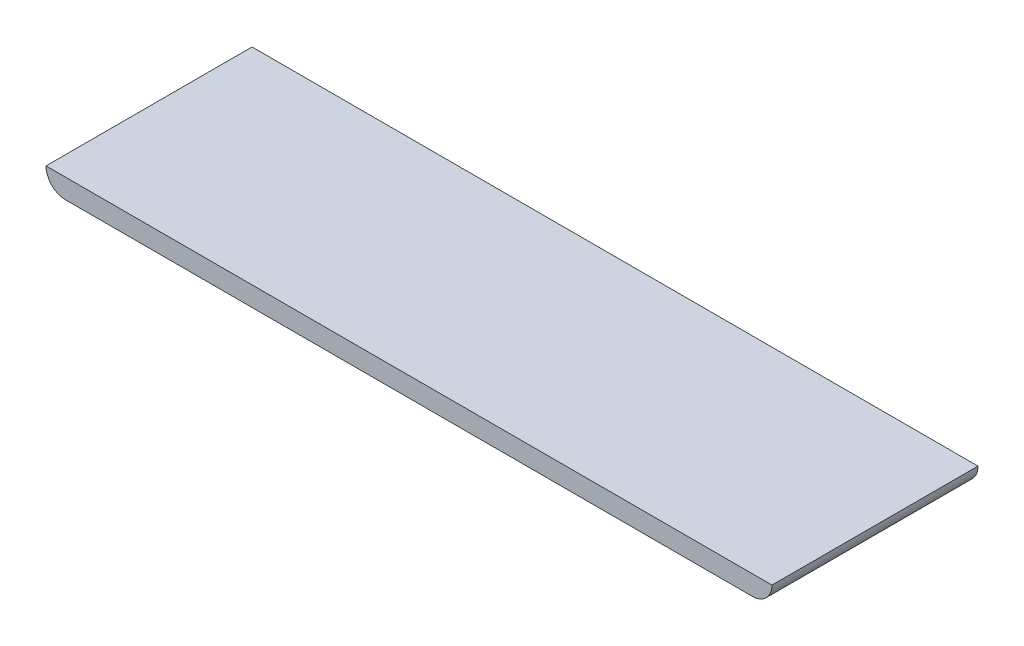
ISO-10303-21;
HEADER;
FILE_DESCRIPTION(('STEP AP214'),'2;1');
FILE_NAME('part.step','',(''),(''),'','','');
FILE_SCHEMA(('AUTOMOTIVE_DESIGN { 1 0 10303 214 1 1 1 1 }'));
ENDSEC;
DATA;
#1=APPLICATION_CONTEXT('core data for automotive mechanical design processes');
#2=APPLICATION_PROTOCOL_DEFINITION('international standard','automotive_design',2000,#1);
#3=PRODUCT_CONTEXT('',#1,'mechanical');
#4=PRODUCT('Part','Part','',(#3));
#5=PRODUCT_RELATED_PRODUCT_CATEGORY('part','',(#4));
#6=PRODUCT_DEFINITION_FORMATION('','',#4);
#7=PRODUCT_DEFINITION_CONTEXT('part definition',#1,'design');
#8=PRODUCT_DEFINITION('design','',#6,#7);
#9=PRODUCT_DEFINITION_SHAPE('','',#8);
#10=(LENGTH_UNIT() NAMED_UNIT(*) SI_UNIT(.MILLI.,.METRE.));
#11=(NAMED_UNIT(*) PLANE_ANGLE_UNIT() SI_UNIT($,.RADIAN.));
#12=(NAMED_UNIT(*) SI_UNIT($,.STERADIAN.) SOLID_ANGLE_UNIT());
#13=UNCERTAINTY_MEASURE_WITH_UNIT(LENGTH_MEASURE(1.E-05),#10,'distance_accuracy_value','');
#14=(GEOMETRIC_REPRESENTATION_CONTEXT(3) GLOBAL_UNCERTAINTY_ASSIGNED_CONTEXT((#13)) GLOBAL_UNIT_ASSIGNED_CONTEXT((#10,
#11,#12)) REPRESENTATION_CONTEXT('',''));
#15=CARTESIAN_POINT('',(0.,0.,0.));
#16=DIRECTION('',(0.,0.,1.));
#17=DIRECTION('',(1.,0.,0.));
#18=AXIS2_PLACEMENT_3D('',#15,#16,#17);
#19=CARTESIAN_POINT('',(-2.,3.,31.5));
#20=DIRECTION('',(0.,0.,-1.));
#21=DIRECTION('',(-1.,0.,0.));
#22=AXIS2_PLACEMENT_3D('',#19,#20,#21);
#23=PLANE('',#22);
#24=DIRECTION('',(1.,0.,0.));
#25=VECTOR('',#24,1.);
#26=CARTESIAN_POINT('',(-2.,3.,31.5));
#27=LINE('',#26,#25);
#28=CARTESIAN_POINT('',(-2.,3.,31.5));
#29=VERTEX_POINT('',#28);
#30=CARTESIAN_POINT('',(109.,3.,31.5));
#31=VERTEX_POINT('',#30);
#32=EDGE_CURVE('E92',#29,#31,#27,.T.);
#33=ORIENTED_EDGE('',*,*,#32,.F.);
#34=CARTESIAN_POINT('',(1.,3.,31.5));
#35=DIRECTION('',(0.,0.,-1.));
#36=DIRECTION('',(-1.,0.,0.));
#37=AXIS2_PLACEMENT_3D('',#34,#35,#36);
#38=CIRCLE('',#37,3.);
#39=CARTESIAN_POINT('',(1.,0.,31.5));
#40=VERTEX_POINT('',#39);
#41=EDGE_CURVE('E80',#29,#40,#38,.F.);
#42=ORIENTED_EDGE('',*,*,#41,.T.);
#43=DIRECTION('',(1.,0.,0.));
#44=VECTOR('',#43,1.);
#45=CARTESIAN_POINT('',(-2.,0.,31.5));
#46=LINE('',#45,#44);
#47=CARTESIAN_POINT('',(106.,0.,31.5));
#48=VERTEX_POINT('',#47);
#49=EDGE_CURVE('E104',#40,#48,#46,.T.);
#50=ORIENTED_EDGE('',*,*,#49,.T.);
#51=CARTESIAN_POINT('',(106.,3.,31.5));
#52=DIRECTION('',(0.,0.,-1.));
#53=DIRECTION('',(-1.,0.,0.));
#54=AXIS2_PLACEMENT_3D('',#51,#52,#53);
#55=CIRCLE('',#54,3.);
#56=EDGE_CURVE('E89',#48,#31,#55,.F.);
#57=ORIENTED_EDGE('',*,*,#56,.T.);
#58=EDGE_LOOP('',(#33,#42,#50,#57));
#59=FACE_BOUND('',#58,.T.);
#60=ADVANCED_FACE('F41',(#59),#23,.F.);
#61=CARTESIAN_POINT('',(-2.,3.,0.));
#62=DIRECTION('',(0.,0.,1.));
#63=DIRECTION('',(1.,0.,0.));
#64=AXIS2_PLACEMENT_3D('',#61,#62,#63);
#65=PLANE('',#64);
#66=DIRECTION('',(-1.,0.,0.));
#67=VECTOR('',#66,1.);
#68=CARTESIAN_POINT('',(-2.,0.,0.));
#69=LINE('',#68,#67);
#70=CARTESIAN_POINT('',(106.,0.,0.));
#71=VERTEX_POINT('',#70);
#72=CARTESIAN_POINT('',(1.,0.,0.));
#73=VERTEX_POINT('',#72);
#74=EDGE_CURVE('E102',#71,#73,#69,.T.);
#75=ORIENTED_EDGE('',*,*,#74,.T.);
#76=CARTESIAN_POINT('',(1.,3.,0.));
#77=DIRECTION('',(0.,0.,1.));
#78=DIRECTION('',(1.,0.,0.));
#79=AXIS2_PLACEMENT_3D('',#76,#77,#78);
#80=CIRCLE('',#79,3.);
#81=CARTESIAN_POINT('',(-2.,3.,0.));
#82=VERTEX_POINT('',#81);
#83=EDGE_CURVE('E11',#73,#82,#80,.F.);
#84=ORIENTED_EDGE('',*,*,#83,.T.);
#85=DIRECTION('',(-1.,0.,0.));
#86=VECTOR('',#85,1.);
#87=CARTESIAN_POINT('',(-2.,3.,0.));
#88=LINE('',#87,#86);
#89=CARTESIAN_POINT('',(109.,3.,0.));
#90=VERTEX_POINT('',#89);
#91=EDGE_CURVE('E101',#90,#82,#88,.T.);
#92=ORIENTED_EDGE('',*,*,#91,.F.);
#93=CARTESIAN_POINT('',(106.,3.,0.));
#94=DIRECTION('',(0.,0.,1.));
#95=DIRECTION('',(1.,0.,0.));
#96=AXIS2_PLACEMENT_3D('',#93,#94,#95);
#97=CIRCLE('',#96,3.);
#98=EDGE_CURVE('E49',#90,#71,#97,.F.);
#99=ORIENTED_EDGE('',*,*,#98,.T.);
#100=EDGE_LOOP('',(#75,#84,#92,#99));
#101=FACE_BOUND('',#100,.T.);
#102=ADVANCED_FACE('F115',(#101),#65,.F.);
#103=CARTESIAN_POINT('',(0.,3.,0.));
#104=DIRECTION('',(0.,-1.,0.));
#105=DIRECTION('',(0.,0.,-1.));
#106=AXIS2_PLACEMENT_3D('',#103,#104,#105);
#107=PLANE('',#106);
#108=DIRECTION('',(0.,0.,1.));
#109=VECTOR('',#108,1.);
#110=CARTESIAN_POINT('',(-2.,3.,31.5));
#111=LINE('',#110,#109);
#112=EDGE_CURVE('E85',#82,#29,#111,.T.);
#113=ORIENTED_EDGE('',*,*,#112,.T.);
#114=ORIENTED_EDGE('',*,*,#32,.T.);
#115=DIRECTION('',(0.,0.,-1.));
#116=VECTOR('',#115,1.);
#117=CARTESIAN_POINT('',(109.,3.,31.5));
#118=LINE('',#117,#116);
#119=EDGE_CURVE('E97',#31,#90,#118,.T.);
#120=ORIENTED_EDGE('',*,*,#119,.T.);
#121=ORIENTED_EDGE('',*,*,#91,.T.);
#122=EDGE_LOOP('',(#113,#114,#120,#121));
#123=FACE_BOUND('',#122,.T.);
#124=ADVANCED_FACE('F100',(#123),#107,.F.);
#125=CARTESIAN_POINT('',(0.,0.,0.));
#126=DIRECTION('',(0.,-1.,0.));
#127=DIRECTION('',(0.,0.,-1.));
#128=AXIS2_PLACEMENT_3D('',#125,#126,#127);
#129=PLANE('',#128);
#130=ORIENTED_EDGE('',*,*,#49,.F.);
#131=DIRECTION('',(0.,0.,1.));
#132=VECTOR('',#131,1.);
#133=CARTESIAN_POINT('',(1.,0.,0.));
#134=LINE('',#133,#132);
#135=EDGE_CURVE('E56',#40,#73,#134,.F.);
#136=ORIENTED_EDGE('',*,*,#135,.T.);
#137=ORIENTED_EDGE('',*,*,#74,.F.);
#138=DIRECTION('',(0.,0.,-1.));
#139=VECTOR('',#138,1.);
#140=CARTESIAN_POINT('',(106.,0.,31.5));
#141=LINE('',#140,#139);
#142=EDGE_CURVE('E88',#71,#48,#141,.F.);
#143=ORIENTED_EDGE('',*,*,#142,.T.);
#144=EDGE_LOOP('',(#130,#136,#137,#143));
#145=FACE_BOUND('',#144,.T.);
#146=ADVANCED_FACE('F113',(#145),#129,.T.);
#147=CARTESIAN_POINT('',(1.,3.,31.5));
#148=DIRECTION('',(0.,0.,-1.));
#149=DIRECTION('',(-1.,0.,0.));
#150=AXIS2_PLACEMENT_3D('',#147,#148,#149);
#151=CYLINDRICAL_SURFACE('',#150,3.);
#152=ORIENTED_EDGE('',*,*,#83,.F.);
#153=ORIENTED_EDGE('',*,*,#135,.F.);
#154=ORIENTED_EDGE('',*,*,#41,.F.);
#155=ORIENTED_EDGE('',*,*,#112,.F.);
#156=EDGE_LOOP('',(#152,#153,#154,#155));
#157=FACE_BOUND('',#156,.T.);
#158=ADVANCED_FACE('F83',(#157),#151,.T.);
#159=CARTESIAN_POINT('',(106.,3.,31.5));
#160=DIRECTION('',(0.,0.,1.));
#161=DIRECTION('',(1.,0.,0.));
#162=AXIS2_PLACEMENT_3D('',#159,#160,#161);
#163=CYLINDRICAL_SURFACE('',#162,3.);
#164=ORIENTED_EDGE('',*,*,#56,.F.);
#165=ORIENTED_EDGE('',*,*,#142,.F.);
#166=ORIENTED_EDGE('',*,*,#98,.F.);
#167=ORIENTED_EDGE('',*,*,#119,.F.);
#168=EDGE_LOOP('',(#164,#165,#166,#167));
#169=FACE_BOUND('',#168,.T.);
#170=ADVANCED_FACE('F43',(#169),#163,.T.);
#171=CLOSED_SHELL('',(#60,#102,#124,#146,#158,#170));
#172=MANIFOLD_SOLID_BREP('B2',#171);
#173=ADVANCED_BREP_SHAPE_REPRESENTATION('',(#18,#172),#14);
#174=SHAPE_DEFINITION_REPRESENTATION(#9,#173);
ENDSEC;
END-ISO-10303-21;
